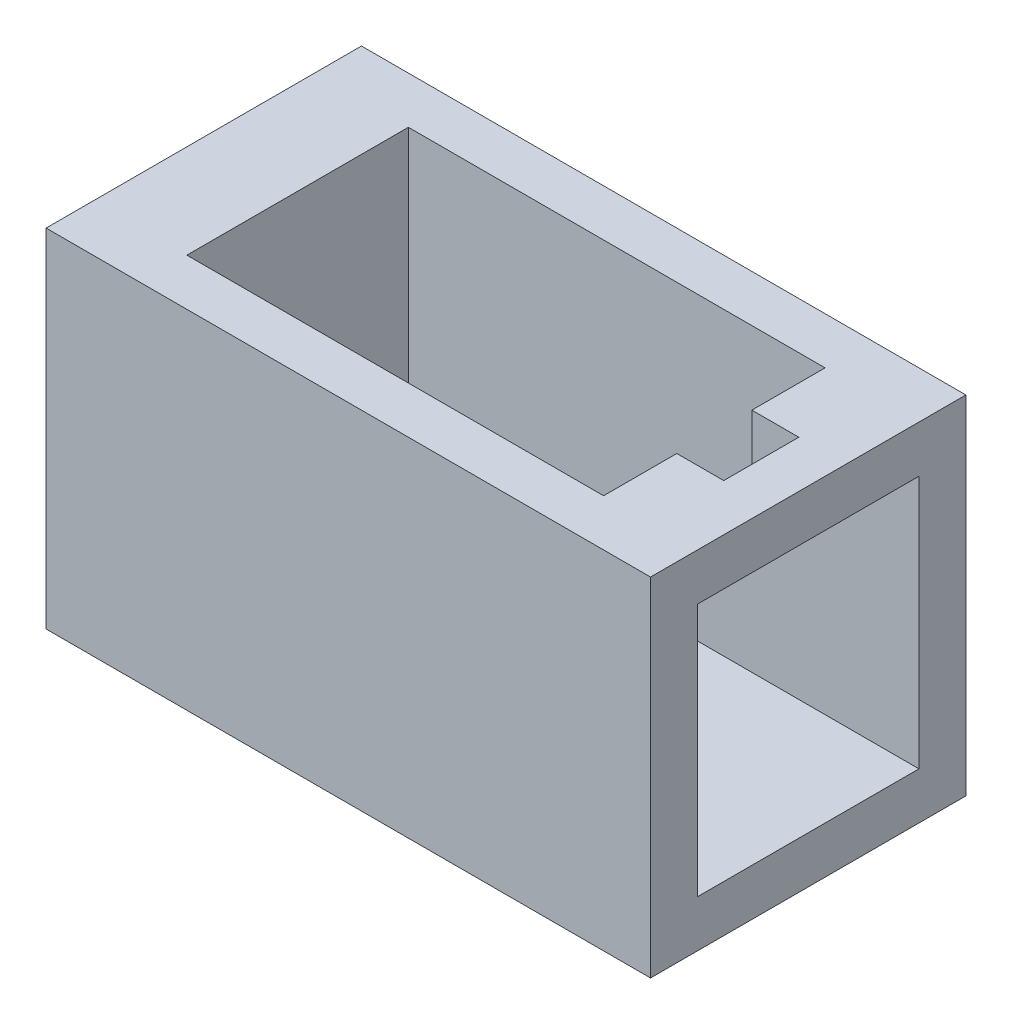
ISO-10303-21;
HEADER;
FILE_DESCRIPTION(('STEP AP214'),'2;1');
FILE_NAME('part.step','',(''),(''),'','','');
FILE_SCHEMA(('AUTOMOTIVE_DESIGN { 1 0 10303 214 1 1 1 1 }'));
ENDSEC;
DATA;
#1=APPLICATION_CONTEXT('core data for automotive mechanical design processes');
#2=APPLICATION_PROTOCOL_DEFINITION('international standard','automotive_design',2000,#1);
#3=PRODUCT_CONTEXT('',#1,'mechanical');
#4=PRODUCT('Part','Part','',(#3));
#5=PRODUCT_RELATED_PRODUCT_CATEGORY('part','',(#4));
#6=PRODUCT_DEFINITION_FORMATION('','',#4);
#7=PRODUCT_DEFINITION_CONTEXT('part definition',#1,'design');
#8=PRODUCT_DEFINITION('design','',#6,#7);
#9=PRODUCT_DEFINITION_SHAPE('','',#8);
#10=(LENGTH_UNIT() NAMED_UNIT(*) SI_UNIT(.MILLI.,.METRE.));
#11=(NAMED_UNIT(*) PLANE_ANGLE_UNIT() SI_UNIT($,.RADIAN.));
#12=(NAMED_UNIT(*) SI_UNIT($,.STERADIAN.) SOLID_ANGLE_UNIT());
#13=UNCERTAINTY_MEASURE_WITH_UNIT(LENGTH_MEASURE(1.E-05),#10,'distance_accuracy_value','');
#14=(GEOMETRIC_REPRESENTATION_CONTEXT(3) GLOBAL_UNCERTAINTY_ASSIGNED_CONTEXT((#13)) GLOBAL_UNIT_ASSIGNED_CONTEXT((#10,
#11,#12)) REPRESENTATION_CONTEXT('',''));
#15=CARTESIAN_POINT('',(0.,0.,0.));
#16=DIRECTION('',(0.,0.,1.));
#17=DIRECTION('',(1.,0.,0.));
#18=AXIS2_PLACEMENT_3D('',#15,#16,#17);
#19=CARTESIAN_POINT('',(11.1,-16.,5.9));
#20=DIRECTION('',(1.,0.,0.));
#21=DIRECTION('',(0.,0.,-1.));
#22=AXIS2_PLACEMENT_3D('',#19,#20,#21);
#23=PLANE('',#22);
#24=DIRECTION('',(0.,0.,-1.));
#25=VECTOR('',#24,1.);
#26=CARTESIAN_POINT('',(11.1,0.,5.9));
#27=LINE('',#26,#25);
#28=CARTESIAN_POINT('',(11.1,0.,5.9));
#29=VERTEX_POINT('',#28);
#30=CARTESIAN_POINT('',(11.1,0.,2.));
#31=VERTEX_POINT('',#30);
#32=EDGE_CURVE('E194',#29,#31,#27,.T.);
#33=ORIENTED_EDGE('',*,*,#32,.T.);
#34=DIRECTION('',(0.,1.,0.));
#35=VECTOR('',#34,1.);
#36=CARTESIAN_POINT('',(11.1,-2.5,2.));
#37=LINE('',#36,#35);
#38=CARTESIAN_POINT('',(11.1,-2.5,2.));
#39=VERTEX_POINT('',#38);
#40=EDGE_CURVE('E166',#39,#31,#37,.T.);
#41=ORIENTED_EDGE('',*,*,#40,.F.);
#42=DIRECTION('',(0.,0.,1.));
#43=VECTOR('',#42,1.);
#44=CARTESIAN_POINT('',(11.1,-2.5,-5.9));
#45=LINE('',#44,#43);
#46=CARTESIAN_POINT('',(11.1,-2.5,5.9));
#47=VERTEX_POINT('',#46);
#48=EDGE_CURVE('E172',#39,#47,#45,.T.);
#49=ORIENTED_EDGE('',*,*,#48,.T.);
#50=DIRECTION('',(0.,1.,0.));
#51=VECTOR('',#50,1.);
#52=CARTESIAN_POINT('',(11.1,-16.,5.9));
#53=LINE('',#52,#51);
#54=EDGE_CURVE('E205',#47,#29,#53,.T.);
#55=ORIENTED_EDGE('',*,*,#54,.T.);
#56=EDGE_LOOP('',(#33,#41,#49,#55));
#57=FACE_BOUND('',#56,.T.);
#58=ADVANCED_FACE('F32',(#57),#23,.F.);
#59=CARTESIAN_POINT('',(16.1,-18.5,8.4));
#60=DIRECTION('',(1.,0.,0.));
#61=DIRECTION('',(0.,0.,-1.));
#62=AXIS2_PLACEMENT_3D('',#59,#60,#61);
#63=PLANE('',#62);
#64=DIRECTION('',(0.,-1.,0.));
#65=VECTOR('',#64,1.);
#66=CARTESIAN_POINT('',(16.1,-16.,5.9));
#67=LINE('',#66,#65);
#68=CARTESIAN_POINT('',(16.1,-2.5,5.9));
#69=VERTEX_POINT('',#68);
#70=CARTESIAN_POINT('',(16.1,-16.,5.9));
#71=VERTEX_POINT('',#70);
#72=EDGE_CURVE('E165',#69,#71,#67,.T.);
#73=ORIENTED_EDGE('',*,*,#72,.F.);
#74=DIRECTION('',(0.,0.,1.));
#75=VECTOR('',#74,1.);
#76=CARTESIAN_POINT('',(16.1,-2.5,-5.9));
#77=LINE('',#76,#75);
#78=CARTESIAN_POINT('',(16.1,-2.5,-5.9));
#79=VERTEX_POINT('',#78);
#80=EDGE_CURVE('E179',#79,#69,#77,.T.);
#81=ORIENTED_EDGE('',*,*,#80,.F.);
#82=DIRECTION('',(0.,1.,0.));
#83=VECTOR('',#82,1.);
#84=CARTESIAN_POINT('',(16.1,-16.,-5.9));
#85=LINE('',#84,#83);
#86=CARTESIAN_POINT('',(16.1,-16.,-5.9));
#87=VERTEX_POINT('',#86);
#88=EDGE_CURVE('E176',#87,#79,#85,.T.);
#89=ORIENTED_EDGE('',*,*,#88,.F.);
#90=DIRECTION('',(0.,0.,-1.));
#91=VECTOR('',#90,1.);
#92=CARTESIAN_POINT('',(16.1,-16.,-5.9));
#93=LINE('',#92,#91);
#94=EDGE_CURVE('E174',#71,#87,#93,.T.);
#95=ORIENTED_EDGE('',*,*,#94,.F.);
#96=EDGE_LOOP('',(#73,#81,#89,#95));
#97=FACE_BOUND('',#96,.T.);
#98=DIRECTION('',(0.,0.,-1.));
#99=VECTOR('',#98,1.);
#100=CARTESIAN_POINT('',(16.1,0.,8.4));
#101=LINE('',#100,#99);
#102=CARTESIAN_POINT('',(16.1,0.,8.4));
#103=VERTEX_POINT('',#102);
#104=CARTESIAN_POINT('',(16.1,0.,-8.4));
#105=VERTEX_POINT('',#104);
#106=EDGE_CURVE('E207',#103,#105,#101,.T.);
#107=ORIENTED_EDGE('',*,*,#106,.F.);
#108=DIRECTION('',(0.,1.,0.));
#109=VECTOR('',#108,1.);
#110=CARTESIAN_POINT('',(16.1,-18.5,8.4));
#111=LINE('',#110,#109);
#112=CARTESIAN_POINT('',(16.1,-18.5,8.4));
#113=VERTEX_POINT('',#112);
#114=EDGE_CURVE('E11',#113,#103,#111,.T.);
#115=ORIENTED_EDGE('',*,*,#114,.F.);
#116=DIRECTION('',(0.,0.,-1.));
#117=VECTOR('',#116,1.);
#118=CARTESIAN_POINT('',(16.1,-18.5,8.4));
#119=LINE('',#118,#117);
#120=CARTESIAN_POINT('',(16.1,-18.5,-8.4));
#121=VERTEX_POINT('',#120);
#122=EDGE_CURVE('E214',#113,#121,#119,.T.);
#123=ORIENTED_EDGE('',*,*,#122,.T.);
#124=DIRECTION('',(0.,1.,0.));
#125=VECTOR('',#124,1.);
#126=CARTESIAN_POINT('',(16.1,-18.5,-8.4));
#127=LINE('',#126,#125);
#128=EDGE_CURVE('E36',#121,#105,#127,.T.);
#129=ORIENTED_EDGE('',*,*,#128,.T.);
#130=EDGE_LOOP('',(#107,#115,#123,#129));
#131=FACE_BOUND('',#130,.T.);
#132=ADVANCED_FACE('F34',(#97,#131),#63,.T.);
#133=CARTESIAN_POINT('',(16.1,-18.5,8.4));
#134=DIRECTION('',(0.,0.,-1.));
#135=DIRECTION('',(-1.,0.,0.));
#136=AXIS2_PLACEMENT_3D('',#133,#134,#135);
#137=PLANE('',#136);
#138=DIRECTION('',(-1.,0.,0.));
#139=VECTOR('',#138,1.);
#140=CARTESIAN_POINT('',(16.1,0.,8.4));
#141=LINE('',#140,#139);
#142=CARTESIAN_POINT('',(-16.1,0.,8.4));
#143=VERTEX_POINT('',#142);
#144=EDGE_CURVE('E218',#103,#143,#141,.T.);
#145=ORIENTED_EDGE('',*,*,#144,.T.);
#146=DIRECTION('',(0.,1.,0.));
#147=VECTOR('',#146,1.);
#148=CARTESIAN_POINT('',(-16.1,-18.5,8.4));
#149=LINE('',#148,#147);
#150=CARTESIAN_POINT('',(-16.1,-18.5,8.4));
#151=VERTEX_POINT('',#150);
#152=EDGE_CURVE('E41',#151,#143,#149,.T.);
#153=ORIENTED_EDGE('',*,*,#152,.F.);
#154=DIRECTION('',(-1.,0.,0.));
#155=VECTOR('',#154,1.);
#156=CARTESIAN_POINT('',(16.1,-18.5,8.4));
#157=LINE('',#156,#155);
#158=EDGE_CURVE('E223',#113,#151,#157,.T.);
#159=ORIENTED_EDGE('',*,*,#158,.F.);
#160=ORIENTED_EDGE('',*,*,#114,.T.);
#161=EDGE_LOOP('',(#145,#153,#159,#160));
#162=FACE_BOUND('',#161,.T.);
#163=ADVANCED_FACE('F250',(#162),#137,.F.);
#164=CARTESIAN_POINT('',(-16.1,-18.5,8.4));
#165=DIRECTION('',(1.,0.,0.));
#166=DIRECTION('',(0.,0.,-1.));
#167=AXIS2_PLACEMENT_3D('',#164,#165,#166);
#168=PLANE('',#167);
#169=DIRECTION('',(0.,0.,-1.));
#170=VECTOR('',#169,1.);
#171=CARTESIAN_POINT('',(-16.1,0.,8.4));
#172=LINE('',#171,#170);
#173=CARTESIAN_POINT('',(-16.1,0.,-8.4));
#174=VERTEX_POINT('',#173);
#175=EDGE_CURVE('E230',#143,#174,#172,.T.);
#176=ORIENTED_EDGE('',*,*,#175,.T.);
#177=DIRECTION('',(0.,1.,0.));
#178=VECTOR('',#177,1.);
#179=CARTESIAN_POINT('',(-16.1,-18.5,-8.4));
#180=LINE('',#179,#178);
#181=CARTESIAN_POINT('',(-16.1,-18.5,-8.4));
#182=VERTEX_POINT('',#181);
#183=EDGE_CURVE('E235',#182,#174,#180,.T.);
#184=ORIENTED_EDGE('',*,*,#183,.F.);
#185=DIRECTION('',(0.,0.,-1.));
#186=VECTOR('',#185,1.);
#187=CARTESIAN_POINT('',(-16.1,-18.5,8.4));
#188=LINE('',#187,#186);
#189=EDGE_CURVE('E221',#151,#182,#188,.T.);
#190=ORIENTED_EDGE('',*,*,#189,.F.);
#191=ORIENTED_EDGE('',*,*,#152,.T.);
#192=EDGE_LOOP('',(#176,#184,#190,#191));
#193=FACE_BOUND('',#192,.T.);
#194=ADVANCED_FACE('F254',(#193),#168,.F.);
#195=CARTESIAN_POINT('',(16.1,-18.5,-8.4));
#196=DIRECTION('',(0.,0.,-1.));
#197=DIRECTION('',(-1.,0.,0.));
#198=AXIS2_PLACEMENT_3D('',#195,#196,#197);
#199=PLANE('',#198);
#200=DIRECTION('',(-1.,0.,0.));
#201=VECTOR('',#200,1.);
#202=CARTESIAN_POINT('',(16.1,0.,-8.4));
#203=LINE('',#202,#201);
#204=EDGE_CURVE('E227',#105,#174,#203,.T.);
#205=ORIENTED_EDGE('',*,*,#204,.F.);
#206=ORIENTED_EDGE('',*,*,#128,.F.);
#207=DIRECTION('',(-1.,0.,0.));
#208=VECTOR('',#207,1.);
#209=CARTESIAN_POINT('',(16.1,-18.5,-8.4));
#210=LINE('',#209,#208);
#211=EDGE_CURVE('E217',#121,#182,#210,.T.);
#212=ORIENTED_EDGE('',*,*,#211,.T.);
#213=ORIENTED_EDGE('',*,*,#183,.T.);
#214=EDGE_LOOP('',(#205,#206,#212,#213));
#215=FACE_BOUND('',#214,.T.);
#216=ADVANCED_FACE('F243',(#215),#199,.T.);
#217=CARTESIAN_POINT('',(0.,-18.5,0.));
#218=DIRECTION('',(0.,1.,0.));
#219=DIRECTION('',(0.,0.,1.));
#220=AXIS2_PLACEMENT_3D('',#217,#218,#219);
#221=PLANE('',#220);
#222=ORIENTED_EDGE('',*,*,#122,.F.);
#223=ORIENTED_EDGE('',*,*,#158,.T.);
#224=ORIENTED_EDGE('',*,*,#189,.T.);
#225=ORIENTED_EDGE('',*,*,#211,.F.);
#226=EDGE_LOOP('',(#222,#223,#224,#225));
#227=FACE_BOUND('',#226,.T.);
#228=ADVANCED_FACE('F256',(#227),#221,.F.);
#229=CARTESIAN_POINT('',(0.,0.,0.));
#230=DIRECTION('',(0.,1.,0.));
#231=DIRECTION('',(0.,0.,1.));
#232=AXIS2_PLACEMENT_3D('',#229,#230,#231);
#233=PLANE('',#232);
#234=DIRECTION('',(1.,0.,0.));
#235=VECTOR('',#234,1.);
#236=CARTESIAN_POINT('',(13.6,0.,2.));
#237=LINE('',#236,#235);
#238=CARTESIAN_POINT('',(13.6,0.,2.));
#239=VERTEX_POINT('',#238);
#240=EDGE_CURVE('E154',#31,#239,#237,.T.);
#241=ORIENTED_EDGE('',*,*,#240,.F.);
#242=ORIENTED_EDGE('',*,*,#32,.F.);
#243=DIRECTION('',(-1.,0.,0.));
#244=VECTOR('',#243,1.);
#245=CARTESIAN_POINT('',(11.1,0.,5.9));
#246=LINE('',#245,#244);
#247=CARTESIAN_POINT('',(-11.1,0.,5.9));
#248=VERTEX_POINT('',#247);
#249=EDGE_CURVE('E190',#29,#248,#246,.T.);
#250=ORIENTED_EDGE('',*,*,#249,.T.);
#251=DIRECTION('',(0.,0.,-1.));
#252=VECTOR('',#251,1.);
#253=CARTESIAN_POINT('',(-11.1,0.,5.9));
#254=LINE('',#253,#252);
#255=CARTESIAN_POINT('',(-11.1,0.,-5.9));
#256=VERTEX_POINT('',#255);
#257=EDGE_CURVE('E200',#248,#256,#254,.T.);
#258=ORIENTED_EDGE('',*,*,#257,.T.);
#259=DIRECTION('',(-1.,0.,0.));
#260=VECTOR('',#259,1.);
#261=CARTESIAN_POINT('',(11.1,0.,-5.9));
#262=LINE('',#261,#260);
#263=CARTESIAN_POINT('',(11.1,0.,-5.9));
#264=VERTEX_POINT('',#263);
#265=EDGE_CURVE('E197',#264,#256,#262,.T.);
#266=ORIENTED_EDGE('',*,*,#265,.F.);
#267=CARTESIAN_POINT('',(11.1,0.,-2.));
#268=VERTEX_POINT('',#267);
#269=EDGE_CURVE('E184',#268,#264,#27,.T.);
#270=ORIENTED_EDGE('',*,*,#269,.F.);
#271=DIRECTION('',(-1.,0.,0.));
#272=VECTOR('',#271,1.);
#273=CARTESIAN_POINT('',(13.6,0.,-2.));
#274=LINE('',#273,#272);
#275=CARTESIAN_POINT('',(13.6,0.,-2.));
#276=VERTEX_POINT('',#275);
#277=EDGE_CURVE('E157',#276,#268,#274,.T.);
#278=ORIENTED_EDGE('',*,*,#277,.F.);
#279=DIRECTION('',(0.,0.,-1.));
#280=VECTOR('',#279,1.);
#281=CARTESIAN_POINT('',(13.6,0.,2.));
#282=LINE('',#281,#280);
#283=EDGE_CURVE('E142',#239,#276,#282,.T.);
#284=ORIENTED_EDGE('',*,*,#283,.F.);
#285=EDGE_LOOP('',(#241,#242,#250,#258,#266,#270,#278,#284));
#286=FACE_BOUND('',#285,.T.);
#287=ORIENTED_EDGE('',*,*,#106,.T.);
#288=ORIENTED_EDGE('',*,*,#204,.T.);
#289=ORIENTED_EDGE('',*,*,#175,.F.);
#290=ORIENTED_EDGE('',*,*,#144,.F.);
#291=EDGE_LOOP('',(#287,#288,#289,#290));
#292=FACE_BOUND('',#291,.T.);
#293=ADVANCED_FACE('F247',(#286,#292),#233,.T.);
#294=CARTESIAN_POINT('',(11.1,-2.5,-5.9));
#295=VERTEX_POINT('',#294);
#296=CARTESIAN_POINT('',(11.1,-2.5,-2.));
#297=VERTEX_POINT('',#296);
#298=EDGE_CURVE('E169',#295,#297,#45,.T.);
#299=ORIENTED_EDGE('',*,*,#298,.T.);
#300=DIRECTION('',(0.,1.,0.));
#301=VECTOR('',#300,1.);
#302=CARTESIAN_POINT('',(11.1,-2.5,-2.));
#303=LINE('',#302,#301);
#304=EDGE_CURVE('E49',#297,#268,#303,.T.);
#305=ORIENTED_EDGE('',*,*,#304,.T.);
#306=ORIENTED_EDGE('',*,*,#269,.T.);
#307=DIRECTION('',(0.,1.,0.));
#308=VECTOR('',#307,1.);
#309=CARTESIAN_POINT('',(11.1,-16.,-5.9));
#310=LINE('',#309,#308);
#311=EDGE_CURVE('E193',#295,#264,#310,.T.);
#312=ORIENTED_EDGE('',*,*,#311,.F.);
#313=EDGE_LOOP('',(#299,#305,#306,#312));
#314=FACE_BOUND('',#313,.T.);
#315=ADVANCED_FACE('F263',(#314),#23,.F.);
#316=CARTESIAN_POINT('',(11.1,-16.,5.9));
#317=DIRECTION('',(0.,0.,-1.));
#318=DIRECTION('',(-1.,0.,0.));
#319=AXIS2_PLACEMENT_3D('',#316,#317,#318);
#320=PLANE('',#319);
#321=ORIENTED_EDGE('',*,*,#249,.F.);
#322=ORIENTED_EDGE('',*,*,#54,.F.);
#323=DIRECTION('',(1.,0.,0.));
#324=VECTOR('',#323,1.);
#325=CARTESIAN_POINT('',(11.1,-2.5,5.9));
#326=LINE('',#325,#324);
#327=EDGE_CURVE('E182',#47,#69,#326,.T.);
#328=ORIENTED_EDGE('',*,*,#327,.T.);
#329=ORIENTED_EDGE('',*,*,#72,.T.);
#330=DIRECTION('',(-1.,0.,0.));
#331=VECTOR('',#330,1.);
#332=CARTESIAN_POINT('',(11.1,-16.,5.9));
#333=LINE('',#332,#331);
#334=CARTESIAN_POINT('',(-11.1,-16.,5.9));
#335=VERTEX_POINT('',#334);
#336=EDGE_CURVE('E57',#71,#335,#333,.T.);
#337=ORIENTED_EDGE('',*,*,#336,.T.);
#338=DIRECTION('',(0.,1.,0.));
#339=VECTOR('',#338,1.);
#340=CARTESIAN_POINT('',(-11.1,-16.,5.9));
#341=LINE('',#340,#339);
#342=EDGE_CURVE('E208',#335,#248,#341,.T.);
#343=ORIENTED_EDGE('',*,*,#342,.T.);
#344=EDGE_LOOP('',(#321,#322,#328,#329,#337,#343));
#345=FACE_BOUND('',#344,.T.);
#346=ADVANCED_FACE('F275',(#345),#320,.T.);
#347=CARTESIAN_POINT('',(-11.1,-16.,5.9));
#348=DIRECTION('',(1.,0.,0.));
#349=DIRECTION('',(0.,0.,-1.));
#350=AXIS2_PLACEMENT_3D('',#347,#348,#349);
#351=PLANE('',#350);
#352=ORIENTED_EDGE('',*,*,#257,.F.);
#353=ORIENTED_EDGE('',*,*,#342,.F.);
#354=DIRECTION('',(0.,0.,-1.));
#355=VECTOR('',#354,1.);
#356=CARTESIAN_POINT('',(-11.1,-16.,5.9));
#357=LINE('',#356,#355);
#358=CARTESIAN_POINT('',(-11.1,-16.,-5.9));
#359=VERTEX_POINT('',#358);
#360=EDGE_CURVE('E189',#335,#359,#357,.T.);
#361=ORIENTED_EDGE('',*,*,#360,.T.);
#362=DIRECTION('',(0.,1.,0.));
#363=VECTOR('',#362,1.);
#364=CARTESIAN_POINT('',(-11.1,-16.,-5.9));
#365=LINE('',#364,#363);
#366=EDGE_CURVE('E210',#359,#256,#365,.T.);
#367=ORIENTED_EDGE('',*,*,#366,.T.);
#368=EDGE_LOOP('',(#352,#353,#361,#367));
#369=FACE_BOUND('',#368,.T.);
#370=ADVANCED_FACE('F280',(#369),#351,.T.);
#371=CARTESIAN_POINT('',(11.1,-16.,-5.9));
#372=DIRECTION('',(0.,0.,-1.));
#373=DIRECTION('',(-1.,0.,0.));
#374=AXIS2_PLACEMENT_3D('',#371,#372,#373);
#375=PLANE('',#374);
#376=ORIENTED_EDGE('',*,*,#265,.T.);
#377=ORIENTED_EDGE('',*,*,#366,.F.);
#378=DIRECTION('',(-1.,0.,0.));
#379=VECTOR('',#378,1.);
#380=CARTESIAN_POINT('',(11.1,-16.,-5.9));
#381=LINE('',#380,#379);
#382=EDGE_CURVE('E186',#87,#359,#381,.T.);
#383=ORIENTED_EDGE('',*,*,#382,.F.);
#384=ORIENTED_EDGE('',*,*,#88,.T.);
#385=DIRECTION('',(1.,0.,0.));
#386=VECTOR('',#385,1.);
#387=CARTESIAN_POINT('',(11.1,-2.5,-5.9));
#388=LINE('',#387,#386);
#389=EDGE_CURVE('E171',#295,#79,#388,.T.);
#390=ORIENTED_EDGE('',*,*,#389,.F.);
#391=ORIENTED_EDGE('',*,*,#311,.T.);
#392=EDGE_LOOP('',(#376,#377,#383,#384,#390,#391));
#393=FACE_BOUND('',#392,.T.);
#394=ADVANCED_FACE('F290',(#393),#375,.F.);
#395=CARTESIAN_POINT('',(0.,-16.,0.));
#396=DIRECTION('',(0.,1.,0.));
#397=DIRECTION('',(0.,0.,1.));
#398=AXIS2_PLACEMENT_3D('',#395,#396,#397);
#399=PLANE('',#398);
#400=ORIENTED_EDGE('',*,*,#336,.F.);
#401=ORIENTED_EDGE('',*,*,#94,.T.);
#402=ORIENTED_EDGE('',*,*,#382,.T.);
#403=ORIENTED_EDGE('',*,*,#360,.F.);
#404=EDGE_LOOP('',(#400,#401,#402,#403));
#405=FACE_BOUND('',#404,.T.);
#406=ADVANCED_FACE('F304',(#405),#399,.T.);
#407=CARTESIAN_POINT('',(11.1,-2.5,-5.9));
#408=DIRECTION('',(0.,1.,0.));
#409=DIRECTION('',(0.,0.,1.));
#410=AXIS2_PLACEMENT_3D('',#407,#408,#409);
#411=PLANE('',#410);
#412=ORIENTED_EDGE('',*,*,#48,.F.);
#413=DIRECTION('',(1.,0.,0.));
#414=VECTOR('',#413,1.);
#415=CARTESIAN_POINT('',(13.6,-2.5,2.));
#416=LINE('',#415,#414);
#417=CARTESIAN_POINT('',(13.6,-2.5,2.));
#418=VERTEX_POINT('',#417);
#419=EDGE_CURVE('E144',#39,#418,#416,.T.);
#420=ORIENTED_EDGE('',*,*,#419,.T.);
#421=DIRECTION('',(0.,0.,-1.));
#422=VECTOR('',#421,1.);
#423=CARTESIAN_POINT('',(13.6,-2.5,2.));
#424=LINE('',#423,#422);
#425=CARTESIAN_POINT('',(13.6,-2.5,-2.));
#426=VERTEX_POINT('',#425);
#427=EDGE_CURVE('E139',#418,#426,#424,.T.);
#428=ORIENTED_EDGE('',*,*,#427,.T.);
#429=DIRECTION('',(-1.,0.,0.));
#430=VECTOR('',#429,1.);
#431=CARTESIAN_POINT('',(13.6,-2.5,-2.));
#432=LINE('',#431,#430);
#433=EDGE_CURVE('E146',#426,#297,#432,.T.);
#434=ORIENTED_EDGE('',*,*,#433,.T.);
#435=ORIENTED_EDGE('',*,*,#298,.F.);
#436=ORIENTED_EDGE('',*,*,#389,.T.);
#437=ORIENTED_EDGE('',*,*,#80,.T.);
#438=ORIENTED_EDGE('',*,*,#327,.F.);
#439=EDGE_LOOP('',(#412,#420,#428,#434,#435,#436,#437,#438));
#440=FACE_BOUND('',#439,.T.);
#441=ADVANCED_FACE('F153',(#440),#411,.F.);
#442=CARTESIAN_POINT('',(13.6,-2.5,2.));
#443=DIRECTION('',(1.,0.,0.));
#444=DIRECTION('',(0.,0.,-1.));
#445=AXIS2_PLACEMENT_3D('',#442,#443,#444);
#446=PLANE('',#445);
#447=ORIENTED_EDGE('',*,*,#283,.T.);
#448=DIRECTION('',(0.,1.,0.));
#449=VECTOR('',#448,1.);
#450=CARTESIAN_POINT('',(13.6,-2.5,-2.));
#451=LINE('',#450,#449);
#452=EDGE_CURVE('E136',#426,#276,#451,.T.);
#453=ORIENTED_EDGE('',*,*,#452,.F.);
#454=ORIENTED_EDGE('',*,*,#427,.F.);
#455=DIRECTION('',(0.,1.,0.));
#456=VECTOR('',#455,1.);
#457=CARTESIAN_POINT('',(13.6,-2.5,2.));
#458=LINE('',#457,#456);
#459=EDGE_CURVE('E163',#418,#239,#458,.T.);
#460=ORIENTED_EDGE('',*,*,#459,.T.);
#461=EDGE_LOOP('',(#447,#453,#454,#460));
#462=FACE_BOUND('',#461,.T.);
#463=ADVANCED_FACE('F137',(#462),#446,.F.);
#464=CARTESIAN_POINT('',(13.6,-2.5,2.));
#465=DIRECTION('',(0.,0.,1.));
#466=DIRECTION('',(1.,0.,0.));
#467=AXIS2_PLACEMENT_3D('',#464,#465,#466);
#468=PLANE('',#467);
#469=ORIENTED_EDGE('',*,*,#240,.T.);
#470=ORIENTED_EDGE('',*,*,#459,.F.);
#471=ORIENTED_EDGE('',*,*,#419,.F.);
#472=ORIENTED_EDGE('',*,*,#40,.T.);
#473=EDGE_LOOP('',(#469,#470,#471,#472));
#474=FACE_BOUND('',#473,.T.);
#475=ADVANCED_FACE('F300',(#474),#468,.F.);
#476=CARTESIAN_POINT('',(13.6,-2.5,-2.));
#477=DIRECTION('',(0.,0.,-1.));
#478=DIRECTION('',(-1.,0.,0.));
#479=AXIS2_PLACEMENT_3D('',#476,#477,#478);
#480=PLANE('',#479);
#481=ORIENTED_EDGE('',*,*,#277,.T.);
#482=ORIENTED_EDGE('',*,*,#304,.F.);
#483=ORIENTED_EDGE('',*,*,#433,.F.);
#484=ORIENTED_EDGE('',*,*,#452,.T.);
#485=EDGE_LOOP('',(#481,#482,#483,#484));
#486=FACE_BOUND('',#485,.T.);
#487=ADVANCED_FACE('F147',(#486),#480,.F.);
#488=CLOSED_SHELL('',(#58,#132,#163,#194,#216,#228,#293,#315,#346,#370,#394,#406,#441,#463,#475,#487));
#489=MANIFOLD_SOLID_BREP('B2',#488);
#490=ADVANCED_BREP_SHAPE_REPRESENTATION('',(#18,#489),#14);
#491=SHAPE_DEFINITION_REPRESENTATION(#9,#490);
ENDSEC;
END-ISO-10303-21;
